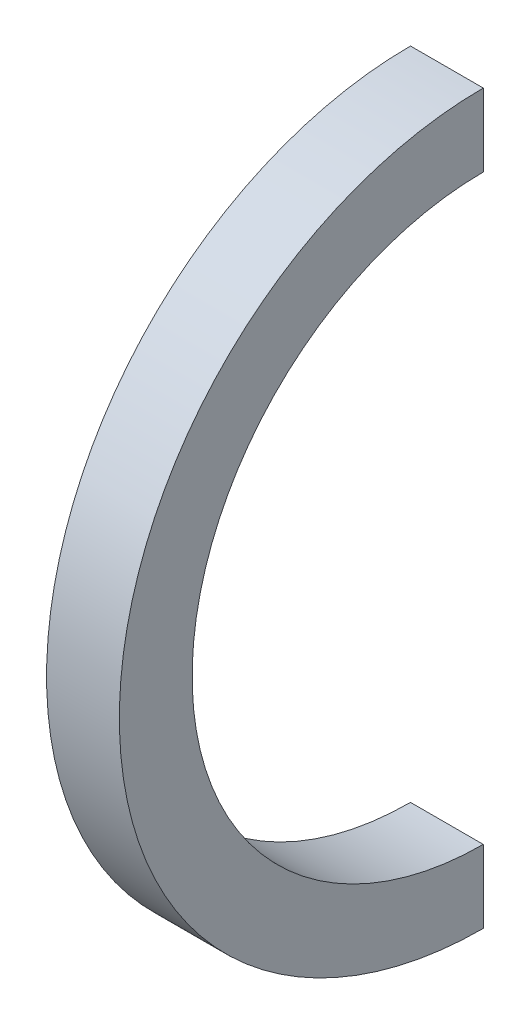
ISO-10303-21;
HEADER;
FILE_DESCRIPTION(('STEP AP214'),'2;1');
FILE_NAME('part.step','',(''),(''),'','','');
FILE_SCHEMA(('AUTOMOTIVE_DESIGN { 1 0 10303 214 1 1 1 1 }'));
ENDSEC;
DATA;
#1=APPLICATION_CONTEXT('core data for automotive mechanical design processes');
#2=APPLICATION_PROTOCOL_DEFINITION('international standard','automotive_design',2000,#1);
#3=PRODUCT_CONTEXT('',#1,'mechanical');
#4=PRODUCT('Part','Part','',(#3));
#5=PRODUCT_RELATED_PRODUCT_CATEGORY('part','',(#4));
#6=PRODUCT_DEFINITION_FORMATION('','',#4);
#7=PRODUCT_DEFINITION_CONTEXT('part definition',#1,'design');
#8=PRODUCT_DEFINITION('design','',#6,#7);
#9=PRODUCT_DEFINITION_SHAPE('','',#8);
#10=(LENGTH_UNIT() NAMED_UNIT(*) SI_UNIT(.MILLI.,.METRE.));
#11=(NAMED_UNIT(*) PLANE_ANGLE_UNIT() SI_UNIT($,.RADIAN.));
#12=(NAMED_UNIT(*) SI_UNIT($,.STERADIAN.) SOLID_ANGLE_UNIT());
#13=UNCERTAINTY_MEASURE_WITH_UNIT(LENGTH_MEASURE(1.E-05),#10,'distance_accuracy_value','');
#14=(GEOMETRIC_REPRESENTATION_CONTEXT(3) GLOBAL_UNCERTAINTY_ASSIGNED_CONTEXT((#13)) GLOBAL_UNIT_ASSIGNED_CONTEXT((#10,
#11,#12)) REPRESENTATION_CONTEXT('',''));
#15=CARTESIAN_POINT('',(0.,0.,0.));
#16=DIRECTION('',(0.,0.,1.));
#17=DIRECTION('',(1.,0.,0.));
#18=AXIS2_PLACEMENT_3D('',#15,#16,#17);
#19=CARTESIAN_POINT('',(0.,254.,-8.86836260066156E-13));
#20=DIRECTION('',(-1.,0.,0.));
#21=DIRECTION('',(0.,0.,1.));
#22=AXIS2_PLACEMENT_3D('',#19,#20,#21);
#23=PLANE('',#22);
#24=CARTESIAN_POINT('',(0.,127.,0.));
#25=DIRECTION('',(1.,0.,0.));
#26=DIRECTION('',(0.,0.,-1.));
#27=AXIS2_PLACEMENT_3D('',#24,#25,#26);
#28=CIRCLE('',#27,101.6);
#29=CARTESIAN_POINT('',(0.,228.6,-7.09469008052925E-13));
#30=VERTEX_POINT('',#29);
#31=CARTESIAN_POINT('',(0.,25.4,0.));
#32=VERTEX_POINT('',#31);
#33=EDGE_CURVE('E11',#30,#32,#28,.T.);
#34=ORIENTED_EDGE('',*,*,#33,.F.);
#35=DIRECTION('',(0.,-1.,0.));
#36=VECTOR('',#35,1.);
#37=CARTESIAN_POINT('',(0.,254.,-8.86836260066156E-13));
#38=LINE('',#37,#36);
#39=CARTESIAN_POINT('',(0.,254.,-8.86836260066156E-13));
#40=VERTEX_POINT('',#39);
#41=EDGE_CURVE('E168',#40,#30,#38,.T.);
#42=ORIENTED_EDGE('',*,*,#41,.F.);
#43=CARTESIAN_POINT('',(0.,127.,0.));
#44=DIRECTION('',(1.,0.,0.));
#45=DIRECTION('',(0.,0.,-1.));
#46=AXIS2_PLACEMENT_3D('',#43,#44,#45);
#47=CIRCLE('',#46,127.);
#48=CARTESIAN_POINT('',(0.,0.,0.));
#49=VERTEX_POINT('',#48);
#50=EDGE_CURVE('E55',#40,#49,#47,.T.);
#51=ORIENTED_EDGE('',*,*,#50,.T.);
#52=DIRECTION('',(0.,1.,0.));
#53=VECTOR('',#52,1.);
#54=CARTESIAN_POINT('',(0.,0.,0.));
#55=LINE('',#54,#53);
#56=EDGE_CURVE('E141',#49,#32,#55,.T.);
#57=ORIENTED_EDGE('',*,*,#56,.T.);
#58=EDGE_LOOP('',(#34,#42,#51,#57));
#59=FACE_BOUND('',#58,.T.);
#60=ADVANCED_FACE('F39',(#59),#23,.F.);
#61=CARTESIAN_POINT('',(0.,127.,0.));
#62=DIRECTION('',(1.,0.,0.));
#63=DIRECTION('',(0.,0.,-1.));
#64=AXIS2_PLACEMENT_3D('',#61,#62,#63);
#65=CYLINDRICAL_SURFACE('',#64,101.6);
#66=CARTESIAN_POINT('',(-25.4,127.,0.));
#67=DIRECTION('',(1.,0.,0.));
#68=DIRECTION('',(0.,0.,-1.));
#69=AXIS2_PLACEMENT_3D('',#66,#67,#68);
#70=CIRCLE('',#69,101.6);
#71=CARTESIAN_POINT('',(-25.4,228.6,-7.09469008052925E-13));
#72=VERTEX_POINT('',#71);
#73=CARTESIAN_POINT('',(-25.4,25.4,0.));
#74=VERTEX_POINT('',#73);
#75=EDGE_CURVE('E48',#72,#74,#70,.T.);
#76=ORIENTED_EDGE('',*,*,#75,.F.);
#77=DIRECTION('',(-1.,0.,0.));
#78=VECTOR('',#77,1.);
#79=CARTESIAN_POINT('',(0.,228.6,-7.09469008052925E-13));
#80=LINE('',#79,#78);
#81=EDGE_CURVE('E172',#30,#72,#80,.T.);
#82=ORIENTED_EDGE('',*,*,#81,.F.);
#83=ORIENTED_EDGE('',*,*,#33,.T.);
#84=DIRECTION('',(-1.,0.,0.));
#85=VECTOR('',#84,1.);
#86=CARTESIAN_POINT('',(0.,25.4,0.));
#87=LINE('',#86,#85);
#88=EDGE_CURVE('E145',#32,#74,#87,.T.);
#89=ORIENTED_EDGE('',*,*,#88,.T.);
#90=EDGE_LOOP('',(#76,#82,#83,#89));
#91=FACE_BOUND('',#90,.T.);
#92=ADVANCED_FACE('F41',(#91),#65,.F.);
#93=CARTESIAN_POINT('',(-25.4,254.,-8.86836260066156E-13));
#94=DIRECTION('',(1.,0.,0.));
#95=DIRECTION('',(0.,0.,-1.));
#96=AXIS2_PLACEMENT_3D('',#93,#94,#95);
#97=PLANE('',#96);
#98=CARTESIAN_POINT('',(-25.4,127.,0.));
#99=DIRECTION('',(1.,0.,0.));
#100=DIRECTION('',(0.,0.,-1.));
#101=AXIS2_PLACEMENT_3D('',#98,#99,#100);
#102=CIRCLE('',#101,127.);
#103=CARTESIAN_POINT('',(-25.4,254.,-8.86836260066156E-13));
#104=VERTEX_POINT('',#103);
#105=CARTESIAN_POINT('',(-25.4,0.,0.));
#106=VERTEX_POINT('',#105);
#107=EDGE_CURVE('E63',#104,#106,#102,.T.);
#108=ORIENTED_EDGE('',*,*,#107,.F.);
#109=DIRECTION('',(0.,1.,0.));
#110=VECTOR('',#109,1.);
#111=CARTESIAN_POINT('',(-25.4,254.,-8.86836260066156E-13));
#112=LINE('',#111,#110);
#113=EDGE_CURVE('E176',#72,#104,#112,.T.);
#114=ORIENTED_EDGE('',*,*,#113,.F.);
#115=ORIENTED_EDGE('',*,*,#75,.T.);
#116=DIRECTION('',(0.,-1.,0.));
#117=VECTOR('',#116,1.);
#118=CARTESIAN_POINT('',(-25.4,0.,0.));
#119=LINE('',#118,#117);
#120=EDGE_CURVE('E149',#74,#106,#119,.T.);
#121=ORIENTED_EDGE('',*,*,#120,.T.);
#122=EDGE_LOOP('',(#108,#114,#115,#121));
#123=FACE_BOUND('',#122,.T.);
#124=ADVANCED_FACE('F194',(#123),#97,.F.);
#125=CARTESIAN_POINT('',(-19.05,234.95,-7.53810821056233E-13));
#126=DIRECTION('',(1.,0.,0.));
#127=DIRECTION('',(0.,0.,-1.));
#128=AXIS2_PLACEMENT_3D('',#125,#126,#127);
#129=PLANE('',#128);
#130=CARTESIAN_POINT('',(-19.05,127.,0.));
#131=DIRECTION('',(1.,0.,0.));
#132=DIRECTION('',(0.,0.,-1.));
#133=AXIS2_PLACEMENT_3D('',#130,#131,#132);
#134=CIRCLE('',#133,107.95);
#135=CARTESIAN_POINT('',(-19.05,234.95,-7.53810821056233E-13));
#136=VERTEX_POINT('',#135);
#137=CARTESIAN_POINT('',(-19.05,19.05,0.));
#138=VERTEX_POINT('',#137);
#139=EDGE_CURVE('E106',#136,#138,#134,.T.);
#140=ORIENTED_EDGE('',*,*,#139,.F.);
#141=DIRECTION('',(0.,1.,0.));
#142=VECTOR('',#141,1.);
#143=CARTESIAN_POINT('',(-19.05,234.95,-7.53810821056233E-13));
#144=LINE('',#143,#142);
#145=CARTESIAN_POINT('',(-19.05,247.65,-8.42494447062848E-13));
#146=VERTEX_POINT('',#145);
#147=EDGE_CURVE('E155',#136,#146,#144,.T.);
#148=ORIENTED_EDGE('',*,*,#147,.T.);
#149=CARTESIAN_POINT('',(-19.05,127.,0.));
#150=DIRECTION('',(1.,0.,0.));
#151=DIRECTION('',(0.,0.,-1.));
#152=AXIS2_PLACEMENT_3D('',#149,#150,#151);
#153=CIRCLE('',#152,120.65);
#154=CARTESIAN_POINT('',(-19.05,6.35,0.));
#155=VERTEX_POINT('',#154);
#156=EDGE_CURVE('E123',#146,#155,#153,.T.);
#157=ORIENTED_EDGE('',*,*,#156,.T.);
#158=DIRECTION('',(0.,-1.,0.));
#159=VECTOR('',#158,1.);
#160=CARTESIAN_POINT('',(-19.05,19.05,0.));
#161=LINE('',#160,#159);
#162=EDGE_CURVE('E121',#138,#155,#161,.T.);
#163=ORIENTED_EDGE('',*,*,#162,.F.);
#164=EDGE_LOOP('',(#140,#148,#157,#163));
#165=FACE_BOUND('',#164,.T.);
#166=ADVANCED_FACE('F122',(#165),#129,.T.);
#167=CARTESIAN_POINT('',(0.,127.,0.));
#168=DIRECTION('',(1.,0.,0.));
#169=DIRECTION('',(0.,0.,-1.));
#170=AXIS2_PLACEMENT_3D('',#167,#168,#169);
#171=CYLINDRICAL_SURFACE('',#170,107.95);
#172=CARTESIAN_POINT('',(-6.35,127.,0.));
#173=DIRECTION('',(1.,0.,0.));
#174=DIRECTION('',(0.,0.,-1.));
#175=AXIS2_PLACEMENT_3D('',#172,#173,#174);
#176=CIRCLE('',#175,107.95);
#177=CARTESIAN_POINT('',(-6.35,234.95,-7.53810821056233E-13));
#178=VERTEX_POINT('',#177);
#179=CARTESIAN_POINT('',(-6.35,19.05,0.));
#180=VERTEX_POINT('',#179);
#181=EDGE_CURVE('E118',#178,#180,#176,.T.);
#182=ORIENTED_EDGE('',*,*,#181,.F.);
#183=DIRECTION('',(-1.,0.,0.));
#184=VECTOR('',#183,1.);
#185=CARTESIAN_POINT('',(-19.05,234.95,-7.53810821056233E-13));
#186=LINE('',#185,#184);
#187=EDGE_CURVE('E113',#178,#136,#186,.T.);
#188=ORIENTED_EDGE('',*,*,#187,.T.);
#189=ORIENTED_EDGE('',*,*,#139,.T.);
#190=DIRECTION('',(-1.,0.,0.));
#191=VECTOR('',#190,1.);
#192=CARTESIAN_POINT('',(-19.05,19.05,0.));
#193=LINE('',#192,#191);
#194=EDGE_CURVE('E110',#180,#138,#193,.T.);
#195=ORIENTED_EDGE('',*,*,#194,.F.);
#196=EDGE_LOOP('',(#182,#188,#189,#195));
#197=FACE_BOUND('',#196,.T.);
#198=ADVANCED_FACE('F108',(#197),#171,.T.);
#199=CARTESIAN_POINT('',(-6.35,234.95,-7.53810821056233E-13));
#200=DIRECTION('',(-1.,0.,0.));
#201=DIRECTION('',(0.,0.,1.));
#202=AXIS2_PLACEMENT_3D('',#199,#200,#201);
#203=PLANE('',#202);
#204=CARTESIAN_POINT('',(-6.35,127.,0.));
#205=DIRECTION('',(1.,0.,0.));
#206=DIRECTION('',(0.,0.,-1.));
#207=AXIS2_PLACEMENT_3D('',#204,#205,#206);
#208=CIRCLE('',#207,120.65);
#209=CARTESIAN_POINT('',(-6.35,247.65,-8.42494447062848E-13));
#210=VERTEX_POINT('',#209);
#211=CARTESIAN_POINT('',(-6.35,6.35,0.));
#212=VERTEX_POINT('',#211);
#213=EDGE_CURVE('E185',#210,#212,#208,.T.);
#214=ORIENTED_EDGE('',*,*,#213,.F.);
#215=DIRECTION('',(0.,-1.,0.));
#216=VECTOR('',#215,1.);
#217=CARTESIAN_POINT('',(-6.35,234.95,-7.53810821056233E-13));
#218=LINE('',#217,#216);
#219=EDGE_CURVE('E160',#210,#178,#218,.T.);
#220=ORIENTED_EDGE('',*,*,#219,.T.);
#221=ORIENTED_EDGE('',*,*,#181,.T.);
#222=DIRECTION('',(0.,1.,0.));
#223=VECTOR('',#222,1.);
#224=CARTESIAN_POINT('',(-6.35,19.05,0.));
#225=LINE('',#224,#223);
#226=EDGE_CURVE('E132',#212,#180,#225,.T.);
#227=ORIENTED_EDGE('',*,*,#226,.F.);
#228=EDGE_LOOP('',(#214,#220,#221,#227));
#229=FACE_BOUND('',#228,.T.);
#230=ADVANCED_FACE('F223',(#229),#203,.T.);
#231=CARTESIAN_POINT('',(0.,127.,0.));
#232=DIRECTION('',(1.,0.,0.));
#233=DIRECTION('',(0.,0.,-1.));
#234=AXIS2_PLACEMENT_3D('',#231,#232,#233);
#235=CYLINDRICAL_SURFACE('',#234,120.65);
#236=DIRECTION('',(1.,0.,0.));
#237=VECTOR('',#236,1.);
#238=CARTESIAN_POINT('',(-19.05,247.65,-8.42494447062848E-13));
#239=LINE('',#238,#237);
#240=EDGE_CURVE('E164',#146,#210,#239,.T.);
#241=ORIENTED_EDGE('',*,*,#240,.T.);
#242=ORIENTED_EDGE('',*,*,#213,.T.);
#243=DIRECTION('',(1.,0.,0.));
#244=VECTOR('',#243,1.);
#245=CARTESIAN_POINT('',(-19.05,6.35,0.));
#246=LINE('',#245,#244);
#247=EDGE_CURVE('E136',#155,#212,#246,.T.);
#248=ORIENTED_EDGE('',*,*,#247,.F.);
#249=ORIENTED_EDGE('',*,*,#156,.F.);
#250=EDGE_LOOP('',(#241,#242,#248,#249));
#251=FACE_BOUND('',#250,.T.);
#252=ADVANCED_FACE('F214',(#251),#235,.F.);
#253=CARTESIAN_POINT('',(0.,127.,0.));
#254=DIRECTION('',(1.,0.,0.));
#255=DIRECTION('',(0.,0.,-1.));
#256=AXIS2_PLACEMENT_3D('',#253,#254,#255);
#257=CYLINDRICAL_SURFACE('',#256,127.);
#258=DIRECTION('',(1.,0.,0.));
#259=VECTOR('',#258,1.);
#260=CARTESIAN_POINT('',(0.,254.,-8.86836260066156E-13));
#261=LINE('',#260,#259);
#262=EDGE_CURVE('E179',#104,#40,#261,.T.);
#263=ORIENTED_EDGE('',*,*,#262,.F.);
#264=ORIENTED_EDGE('',*,*,#107,.T.);
#265=DIRECTION('',(1.,0.,0.));
#266=VECTOR('',#265,1.);
#267=CARTESIAN_POINT('',(0.,0.,0.));
#268=LINE('',#267,#266);
#269=EDGE_CURVE('E152',#106,#49,#268,.T.);
#270=ORIENTED_EDGE('',*,*,#269,.T.);
#271=ORIENTED_EDGE('',*,*,#50,.F.);
#272=EDGE_LOOP('',(#263,#264,#270,#271));
#273=FACE_BOUND('',#272,.T.);
#274=ADVANCED_FACE('F201',(#273),#257,.T.);
#275=CARTESIAN_POINT('',(0.,254.,-8.86836260066156E-13));
#276=DIRECTION('',(0.,0.,-1.));
#277=DIRECTION('',(1.,0.,0.));
#278=AXIS2_PLACEMENT_3D('',#275,#276,#277);
#279=PLANE('',#278);
#280=ORIENTED_EDGE('',*,*,#147,.F.);
#281=ORIENTED_EDGE('',*,*,#187,.F.);
#282=ORIENTED_EDGE('',*,*,#219,.F.);
#283=ORIENTED_EDGE('',*,*,#240,.F.);
#284=EDGE_LOOP('',(#280,#281,#282,#283));
#285=FACE_BOUND('',#284,.T.);
#286=ORIENTED_EDGE('',*,*,#41,.T.);
#287=ORIENTED_EDGE('',*,*,#81,.T.);
#288=ORIENTED_EDGE('',*,*,#113,.T.);
#289=ORIENTED_EDGE('',*,*,#262,.T.);
#290=EDGE_LOOP('',(#286,#287,#288,#289));
#291=FACE_BOUND('',#290,.T.);
#292=ADVANCED_FACE('F203',(#285,#291),#279,.T.);
#293=CARTESIAN_POINT('',(0.,0.,0.));
#294=DIRECTION('',(0.,0.,1.));
#295=DIRECTION('',(1.,0.,0.));
#296=AXIS2_PLACEMENT_3D('',#293,#294,#295);
#297=PLANE('',#296);
#298=ORIENTED_EDGE('',*,*,#162,.T.);
#299=ORIENTED_EDGE('',*,*,#247,.T.);
#300=ORIENTED_EDGE('',*,*,#226,.T.);
#301=ORIENTED_EDGE('',*,*,#194,.T.);
#302=EDGE_LOOP('',(#298,#299,#300,#301));
#303=FACE_BOUND('',#302,.T.);
#304=ORIENTED_EDGE('',*,*,#56,.F.);
#305=ORIENTED_EDGE('',*,*,#269,.F.);
#306=ORIENTED_EDGE('',*,*,#120,.F.);
#307=ORIENTED_EDGE('',*,*,#88,.F.);
#308=EDGE_LOOP('',(#304,#305,#306,#307));
#309=FACE_BOUND('',#308,.T.);
#310=ADVANCED_FACE('F129',(#303,#309),#297,.F.);
#311=CLOSED_SHELL('',(#60,#92,#124,#166,#198,#230,#252,#274,#292,#310));
#312=MANIFOLD_SOLID_BREP('B2',#311);
#313=ADVANCED_BREP_SHAPE_REPRESENTATION('',(#18,#312),#14);
#314=SHAPE_DEFINITION_REPRESENTATION(#9,#313);
ENDSEC;
END-ISO-10303-21;
